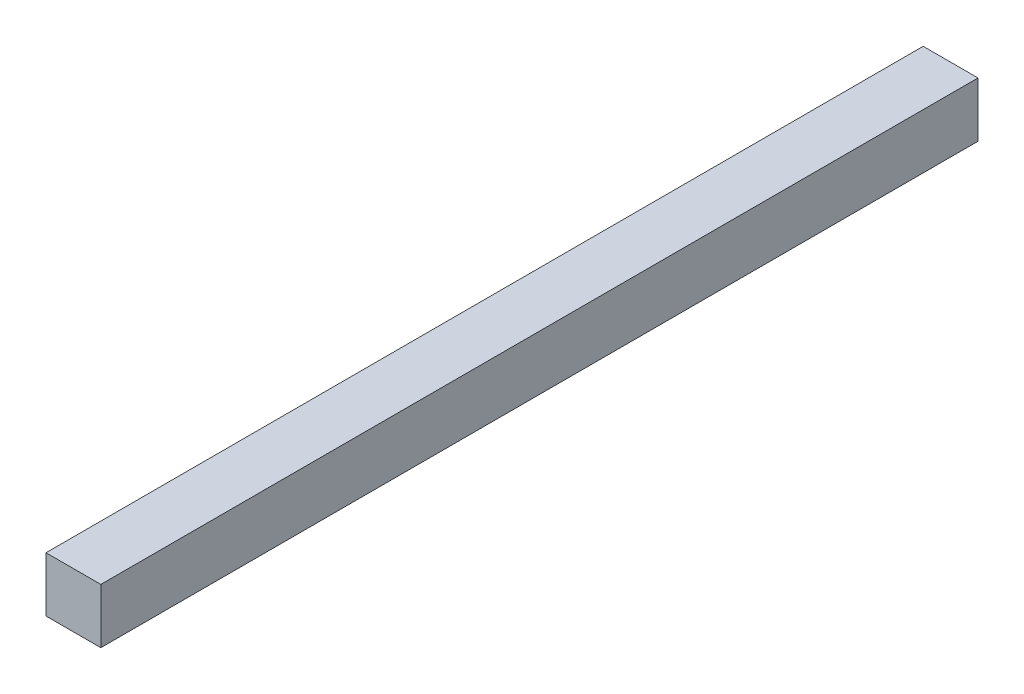
ISO-10303-21;
HEADER;
FILE_DESCRIPTION(('STEP AP214'),'2;1');
FILE_NAME('part.step','',(''),(''),'','','');
FILE_SCHEMA(('AUTOMOTIVE_DESIGN { 1 0 10303 214 1 1 1 1 }'));
ENDSEC;
DATA;
#1=APPLICATION_CONTEXT('core data for automotive mechanical design processes');
#2=APPLICATION_PROTOCOL_DEFINITION('international standard','automotive_design',2000,#1);
#3=PRODUCT_CONTEXT('',#1,'mechanical');
#4=PRODUCT('Part','Part','',(#3));
#5=PRODUCT_RELATED_PRODUCT_CATEGORY('part','',(#4));
#6=PRODUCT_DEFINITION_FORMATION('','',#4);
#7=PRODUCT_DEFINITION_CONTEXT('part definition',#1,'design');
#8=PRODUCT_DEFINITION('design','',#6,#7);
#9=PRODUCT_DEFINITION_SHAPE('','',#8);
#10=(LENGTH_UNIT() NAMED_UNIT(*) SI_UNIT(.MILLI.,.METRE.));
#11=(NAMED_UNIT(*) PLANE_ANGLE_UNIT() SI_UNIT($,.RADIAN.));
#12=(NAMED_UNIT(*) SI_UNIT($,.STERADIAN.) SOLID_ANGLE_UNIT());
#13=UNCERTAINTY_MEASURE_WITH_UNIT(LENGTH_MEASURE(1.E-05),#10,'distance_accuracy_value','');
#14=(GEOMETRIC_REPRESENTATION_CONTEXT(3) GLOBAL_UNCERTAINTY_ASSIGNED_CONTEXT((#13)) GLOBAL_UNIT_ASSIGNED_CONTEXT((#10,
#11,#12)) REPRESENTATION_CONTEXT('',''));
#15=CARTESIAN_POINT('',(0.,0.,0.));
#16=DIRECTION('',(0.,0.,1.));
#17=DIRECTION('',(1.,0.,0.));
#18=AXIS2_PLACEMENT_3D('',#15,#16,#17);
#19=CARTESIAN_POINT('',(-9.525,-9.525,152.4));
#20=DIRECTION('',(-1.,0.,0.));
#21=DIRECTION('',(0.,0.,1.));
#22=AXIS2_PLACEMENT_3D('',#19,#20,#21);
#23=PLANE('',#22);
#24=DIRECTION('',(0.,1.,0.));
#25=VECTOR('',#24,1.);
#26=CARTESIAN_POINT('',(-9.525,-9.525,-152.4));
#27=LINE('',#26,#25);
#28=CARTESIAN_POINT('',(-9.525,-9.525,-152.4));
#29=VERTEX_POINT('',#28);
#30=CARTESIAN_POINT('',(-9.525,9.525,-152.4));
#31=VERTEX_POINT('',#30);
#32=EDGE_CURVE('E98',#29,#31,#27,.T.);
#33=ORIENTED_EDGE('',*,*,#32,.F.);
#34=DIRECTION('',(0.,0.,-1.));
#35=VECTOR('',#34,1.);
#36=CARTESIAN_POINT('',(-9.525,-9.525,152.4));
#37=LINE('',#36,#35);
#38=CARTESIAN_POINT('',(-9.525,-9.525,152.4));
#39=VERTEX_POINT('',#38);
#40=EDGE_CURVE('E11',#39,#29,#37,.T.);
#41=ORIENTED_EDGE('',*,*,#40,.F.);
#42=DIRECTION('',(0.,1.,0.));
#43=VECTOR('',#42,1.);
#44=CARTESIAN_POINT('',(-9.525,-9.525,152.4));
#45=LINE('',#44,#43);
#46=CARTESIAN_POINT('',(-9.525,9.525,152.4));
#47=VERTEX_POINT('',#46);
#48=EDGE_CURVE('E93',#39,#47,#45,.T.);
#49=ORIENTED_EDGE('',*,*,#48,.T.);
#50=DIRECTION('',(0.,0.,-1.));
#51=VECTOR('',#50,1.);
#52=CARTESIAN_POINT('',(-9.525,9.525,152.4));
#53=LINE('',#52,#51);
#54=EDGE_CURVE('E36',#47,#31,#53,.T.);
#55=ORIENTED_EDGE('',*,*,#54,.T.);
#56=EDGE_LOOP('',(#33,#41,#49,#55));
#57=FACE_BOUND('',#56,.T.);
#58=ADVANCED_FACE('F33',(#57),#23,.T.);
#59=CARTESIAN_POINT('',(-9.525,-9.525,152.4));
#60=DIRECTION('',(0.,1.,0.));
#61=DIRECTION('',(0.,0.,1.));
#62=AXIS2_PLACEMENT_3D('',#59,#60,#61);
#63=PLANE('',#62);
#64=DIRECTION('',(1.,0.,0.));
#65=VECTOR('',#64,1.);
#66=CARTESIAN_POINT('',(-9.525,-9.525,-152.4));
#67=LINE('',#66,#65);
#68=CARTESIAN_POINT('',(9.525,-9.525,-152.4));
#69=VERTEX_POINT('',#68);
#70=EDGE_CURVE('E66',#29,#69,#67,.T.);
#71=ORIENTED_EDGE('',*,*,#70,.T.);
#72=DIRECTION('',(0.,0.,-1.));
#73=VECTOR('',#72,1.);
#74=CARTESIAN_POINT('',(9.525,-9.525,152.4));
#75=LINE('',#74,#73);
#76=CARTESIAN_POINT('',(9.525,-9.525,152.4));
#77=VERTEX_POINT('',#76);
#78=EDGE_CURVE('E42',#77,#69,#75,.T.);
#79=ORIENTED_EDGE('',*,*,#78,.F.);
#80=DIRECTION('',(1.,0.,0.));
#81=VECTOR('',#80,1.);
#82=CARTESIAN_POINT('',(-9.525,-9.525,152.4));
#83=LINE('',#82,#81);
#84=EDGE_CURVE('E83',#39,#77,#83,.T.);
#85=ORIENTED_EDGE('',*,*,#84,.F.);
#86=ORIENTED_EDGE('',*,*,#40,.T.);
#87=EDGE_LOOP('',(#71,#79,#85,#86));
#88=FACE_BOUND('',#87,.T.);
#89=ADVANCED_FACE('F108',(#88),#63,.F.);
#90=CARTESIAN_POINT('',(9.525,-9.525,152.4));
#91=DIRECTION('',(-1.,0.,0.));
#92=DIRECTION('',(0.,0.,1.));
#93=AXIS2_PLACEMENT_3D('',#90,#91,#92);
#94=PLANE('',#93);
#95=DIRECTION('',(0.,1.,0.));
#96=VECTOR('',#95,1.);
#97=CARTESIAN_POINT('',(9.525,-9.525,-152.4));
#98=LINE('',#97,#96);
#99=CARTESIAN_POINT('',(9.525,9.525,-152.4));
#100=VERTEX_POINT('',#99);
#101=EDGE_CURVE('E90',#69,#100,#98,.T.);
#102=ORIENTED_EDGE('',*,*,#101,.T.);
#103=DIRECTION('',(0.,0.,-1.));
#104=VECTOR('',#103,1.);
#105=CARTESIAN_POINT('',(9.525,9.525,152.4));
#106=LINE('',#105,#104);
#107=CARTESIAN_POINT('',(9.525,9.525,152.4));
#108=VERTEX_POINT('',#107);
#109=EDGE_CURVE('E87',#108,#100,#106,.T.);
#110=ORIENTED_EDGE('',*,*,#109,.F.);
#111=DIRECTION('',(0.,1.,0.));
#112=VECTOR('',#111,1.);
#113=CARTESIAN_POINT('',(9.525,-9.525,152.4));
#114=LINE('',#113,#112);
#115=EDGE_CURVE('E78',#77,#108,#114,.T.);
#116=ORIENTED_EDGE('',*,*,#115,.F.);
#117=ORIENTED_EDGE('',*,*,#78,.T.);
#118=EDGE_LOOP('',(#102,#110,#116,#117));
#119=FACE_BOUND('',#118,.T.);
#120=ADVANCED_FACE('F88',(#119),#94,.F.);
#121=CARTESIAN_POINT('',(-9.525,9.525,152.4));
#122=DIRECTION('',(0.,1.,0.));
#123=DIRECTION('',(0.,0.,1.));
#124=AXIS2_PLACEMENT_3D('',#121,#122,#123);
#125=PLANE('',#124);
#126=DIRECTION('',(1.,0.,0.));
#127=VECTOR('',#126,1.);
#128=CARTESIAN_POINT('',(-9.525,9.525,-152.4));
#129=LINE('',#128,#127);
#130=EDGE_CURVE('E101',#31,#100,#129,.T.);
#131=ORIENTED_EDGE('',*,*,#130,.F.);
#132=ORIENTED_EDGE('',*,*,#54,.F.);
#133=DIRECTION('',(1.,0.,0.));
#134=VECTOR('',#133,1.);
#135=CARTESIAN_POINT('',(-9.525,9.525,152.4));
#136=LINE('',#135,#134);
#137=EDGE_CURVE('E82',#47,#108,#136,.T.);
#138=ORIENTED_EDGE('',*,*,#137,.T.);
#139=ORIENTED_EDGE('',*,*,#109,.T.);
#140=EDGE_LOOP('',(#131,#132,#138,#139));
#141=FACE_BOUND('',#140,.T.);
#142=ADVANCED_FACE('F92',(#141),#125,.T.);
#143=CARTESIAN_POINT('',(0.,0.,152.4));
#144=DIRECTION('',(0.,0.,-1.));
#145=DIRECTION('',(-1.,0.,0.));
#146=AXIS2_PLACEMENT_3D('',#143,#144,#145);
#147=PLANE('',#146);
#148=ORIENTED_EDGE('',*,*,#48,.F.);
#149=ORIENTED_EDGE('',*,*,#84,.T.);
#150=ORIENTED_EDGE('',*,*,#115,.T.);
#151=ORIENTED_EDGE('',*,*,#137,.F.);
#152=EDGE_LOOP('',(#148,#149,#150,#151));
#153=FACE_BOUND('',#152,.T.);
#154=ADVANCED_FACE('F81',(#153),#147,.F.);
#155=CARTESIAN_POINT('',(0.,0.,-152.4));
#156=DIRECTION('',(0.,0.,-1.));
#157=DIRECTION('',(-1.,0.,0.));
#158=AXIS2_PLACEMENT_3D('',#155,#156,#157);
#159=PLANE('',#158);
#160=ORIENTED_EDGE('',*,*,#32,.T.);
#161=ORIENTED_EDGE('',*,*,#130,.T.);
#162=ORIENTED_EDGE('',*,*,#101,.F.);
#163=ORIENTED_EDGE('',*,*,#70,.F.);
#164=EDGE_LOOP('',(#160,#161,#162,#163));
#165=FACE_BOUND('',#164,.T.);
#166=ADVANCED_FACE('F106',(#165),#159,.T.);
#167=CLOSED_SHELL('',(#58,#89,#120,#142,#154,#166));
#168=MANIFOLD_SOLID_BREP('B2',#167);
#169=ADVANCED_BREP_SHAPE_REPRESENTATION('',(#18,#168),#14);
#170=SHAPE_DEFINITION_REPRESENTATION(#9,#169);
ENDSEC;
END-ISO-10303-21;
